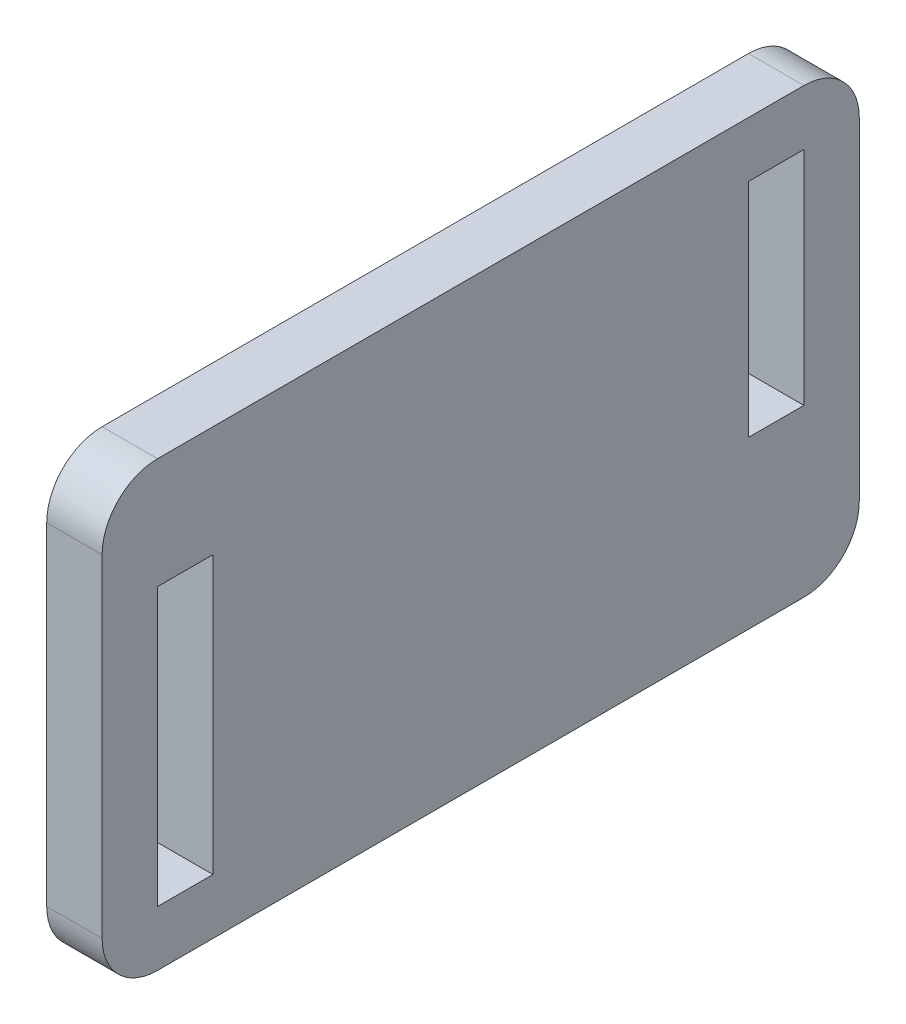
ISO-10303-21;
HEADER;
FILE_DESCRIPTION(('STEP AP214'),'2;1');
FILE_NAME('part.step','',(''),(''),'','','');
FILE_SCHEMA(('AUTOMOTIVE_DESIGN { 1 0 10303 214 1 1 1 1 }'));
ENDSEC;
DATA;
#1=APPLICATION_CONTEXT('core data for automotive mechanical design processes');
#2=APPLICATION_PROTOCOL_DEFINITION('international standard','automotive_design',2000,#1);
#3=PRODUCT_CONTEXT('',#1,'mechanical');
#4=PRODUCT('Part','Part','',(#3));
#5=PRODUCT_RELATED_PRODUCT_CATEGORY('part','',(#4));
#6=PRODUCT_DEFINITION_FORMATION('','',#4);
#7=PRODUCT_DEFINITION_CONTEXT('part definition',#1,'design');
#8=PRODUCT_DEFINITION('design','',#6,#7);
#9=PRODUCT_DEFINITION_SHAPE('','',#8);
#10=(LENGTH_UNIT() NAMED_UNIT(*) SI_UNIT(.MILLI.,.METRE.));
#11=(NAMED_UNIT(*) PLANE_ANGLE_UNIT() SI_UNIT($,.RADIAN.));
#12=(NAMED_UNIT(*) SI_UNIT($,.STERADIAN.) SOLID_ANGLE_UNIT());
#13=UNCERTAINTY_MEASURE_WITH_UNIT(LENGTH_MEASURE(1.E-05),#10,'distance_accuracy_value','');
#14=(GEOMETRIC_REPRESENTATION_CONTEXT(3) GLOBAL_UNCERTAINTY_ASSIGNED_CONTEXT((#13)) GLOBAL_UNIT_ASSIGNED_CONTEXT((#10,
#11,#12)) REPRESENTATION_CONTEXT('',''));
#15=CARTESIAN_POINT('',(0.,0.,0.));
#16=DIRECTION('',(0.,0.,1.));
#17=DIRECTION('',(1.,0.,0.));
#18=AXIS2_PLACEMENT_3D('',#15,#16,#17);
#19=CARTESIAN_POINT('',(3.,0.,0.));
#20=DIRECTION('',(-1.,0.,0.));
#21=DIRECTION('',(0.,0.,1.));
#22=AXIS2_PLACEMENT_3D('',#19,#20,#21);
#23=PLANE('',#22);
#24=DIRECTION('',(0.,-1.,0.));
#25=VECTOR('',#24,1.);
#26=CARTESIAN_POINT('',(3.,-9.00000000000001,17.5000000000001));
#27=LINE('',#26,#25);
#28=CARTESIAN_POINT('',(3.,5.99999999999999,17.5000000000001));
#29=VERTEX_POINT('',#28);
#30=CARTESIAN_POINT('',(3.,-9.00000000000001,17.5000000000001));
#31=VERTEX_POINT('',#30);
#32=EDGE_CURVE('E211',#29,#31,#27,.T.);
#33=ORIENTED_EDGE('',*,*,#32,.F.);
#34=DIRECTION('',(0.,0.,1.));
#35=VECTOR('',#34,1.);
#36=CARTESIAN_POINT('',(3.,5.99999999999999,17.5000000000001));
#37=LINE('',#36,#35);
#38=CARTESIAN_POINT('',(3.,5.99999999999999,14.5000000000001));
#39=VERTEX_POINT('',#38);
#40=EDGE_CURVE('E222',#39,#29,#37,.T.);
#41=ORIENTED_EDGE('',*,*,#40,.F.);
#42=DIRECTION('',(0.,1.,0.));
#43=VECTOR('',#42,1.);
#44=CARTESIAN_POINT('',(3.,-9.00000000000001,14.5000000000001));
#45=LINE('',#44,#43);
#46=CARTESIAN_POINT('',(3.,-9.00000000000001,14.5000000000001));
#47=VERTEX_POINT('',#46);
#48=EDGE_CURVE('E218',#47,#39,#45,.T.);
#49=ORIENTED_EDGE('',*,*,#48,.F.);
#50=DIRECTION('',(0.,0.,-1.));
#51=VECTOR('',#50,1.);
#52=CARTESIAN_POINT('',(3.,-9.00000000000001,17.5000000000001));
#53=LINE('',#52,#51);
#54=EDGE_CURVE('E214',#31,#47,#53,.T.);
#55=ORIENTED_EDGE('',*,*,#54,.F.);
#56=EDGE_LOOP('',(#33,#41,#49,#55));
#57=FACE_BOUND('',#56,.T.);
#58=DIRECTION('',(0.,0.,-1.));
#59=VECTOR('',#58,1.);
#60=CARTESIAN_POINT('',(3.,-12.,-20.5000000000001));
#61=LINE('',#60,#59);
#62=CARTESIAN_POINT('',(3.,-12.,17.5000000000001));
#63=VERTEX_POINT('',#62);
#64=CARTESIAN_POINT('',(3.,-12.,-17.5000000000001));
#65=VERTEX_POINT('',#64);
#66=EDGE_CURVE('E258',#63,#65,#61,.T.);
#67=ORIENTED_EDGE('',*,*,#66,.T.);
#68=CARTESIAN_POINT('',(3.,-9.00000000000001,-17.5000000000001));
#69=DIRECTION('',(-1.,0.,0.));
#70=DIRECTION('',(0.,0.,1.));
#71=AXIS2_PLACEMENT_3D('',#68,#69,#70);
#72=CIRCLE('',#71,3.);
#73=CARTESIAN_POINT('',(3.,-9.00000000000001,-20.5000000000001));
#74=VERTEX_POINT('',#73);
#75=EDGE_CURVE('E316',#65,#74,#72,.F.);
#76=ORIENTED_EDGE('',*,*,#75,.T.);
#77=DIRECTION('',(0.,1.,0.));
#78=VECTOR('',#77,1.);
#79=CARTESIAN_POINT('',(3.,12.,-20.5000000000001));
#80=LINE('',#79,#78);
#81=CARTESIAN_POINT('',(3.,9.00000000000001,-20.5000000000001));
#82=VERTEX_POINT('',#81);
#83=EDGE_CURVE('E263',#74,#82,#80,.T.);
#84=ORIENTED_EDGE('',*,*,#83,.T.);
#85=CARTESIAN_POINT('',(3.,9.00000000000001,-17.5000000000001));
#86=DIRECTION('',(-1.,0.,0.));
#87=DIRECTION('',(0.,0.,1.));
#88=AXIS2_PLACEMENT_3D('',#85,#86,#87);
#89=CIRCLE('',#88,3.);
#90=CARTESIAN_POINT('',(3.,12.,-17.5000000000001));
#91=VERTEX_POINT('',#90);
#92=EDGE_CURVE('E64',#82,#91,#89,.F.);
#93=ORIENTED_EDGE('',*,*,#92,.T.);
#94=DIRECTION('',(0.,0.,1.));
#95=VECTOR('',#94,1.);
#96=CARTESIAN_POINT('',(3.,12.,20.5000000000001));
#97=LINE('',#96,#95);
#98=CARTESIAN_POINT('',(3.,12.,17.5000000000001));
#99=VERTEX_POINT('',#98);
#100=EDGE_CURVE('E266',#91,#99,#97,.T.);
#101=ORIENTED_EDGE('',*,*,#100,.T.);
#102=CARTESIAN_POINT('',(3.,9.00000000000001,17.5000000000001));
#103=DIRECTION('',(-1.,0.,0.));
#104=DIRECTION('',(0.,0.,1.));
#105=AXIS2_PLACEMENT_3D('',#102,#103,#104);
#106=CIRCLE('',#105,3.);
#107=CARTESIAN_POINT('',(3.,9.00000000000001,20.5000000000001));
#108=VERTEX_POINT('',#107);
#109=EDGE_CURVE('E310',#99,#108,#106,.F.);
#110=ORIENTED_EDGE('',*,*,#109,.T.);
#111=DIRECTION('',(0.,-1.,0.));
#112=VECTOR('',#111,1.);
#113=CARTESIAN_POINT('',(3.,-12.,20.5000000000001));
#114=LINE('',#113,#112);
#115=CARTESIAN_POINT('',(3.,-9.00000000000001,20.5000000000001));
#116=VERTEX_POINT('',#115);
#117=EDGE_CURVE('E254',#108,#116,#114,.T.);
#118=ORIENTED_EDGE('',*,*,#117,.T.);
#119=CARTESIAN_POINT('',(3.,-9.00000000000001,17.5000000000001));
#120=DIRECTION('',(-1.,0.,0.));
#121=DIRECTION('',(0.,0.,1.));
#122=AXIS2_PLACEMENT_3D('',#119,#120,#121);
#123=CIRCLE('',#122,3.);
#124=EDGE_CURVE('E313',#116,#63,#123,.F.);
#125=ORIENTED_EDGE('',*,*,#124,.T.);
#126=EDGE_LOOP('',(#67,#76,#84,#93,#101,#110,#118,#125));
#127=FACE_BOUND('',#126,.T.);
#128=DIRECTION('',(0.,-1.,0.));
#129=VECTOR('',#128,1.);
#130=CARTESIAN_POINT('',(3.,-3.,-14.5000000000001));
#131=LINE('',#130,#129);
#132=CARTESIAN_POINT('',(3.,9.00000000000001,-14.5000000000001));
#133=VERTEX_POINT('',#132);
#134=CARTESIAN_POINT('',(3.,-3.,-14.5000000000001));
#135=VERTEX_POINT('',#134);
#136=EDGE_CURVE('E158',#133,#135,#131,.T.);
#137=ORIENTED_EDGE('',*,*,#136,.F.);
#138=DIRECTION('',(0.,0.,1.));
#139=VECTOR('',#138,1.);
#140=CARTESIAN_POINT('',(3.,9.00000000000001,-14.5000000000001));
#141=LINE('',#140,#139);
#142=CARTESIAN_POINT('',(3.,9.00000000000001,-17.5000000000001));
#143=VERTEX_POINT('',#142);
#144=EDGE_CURVE('E187',#143,#133,#141,.T.);
#145=ORIENTED_EDGE('',*,*,#144,.F.);
#146=DIRECTION('',(0.,1.,0.));
#147=VECTOR('',#146,1.);
#148=CARTESIAN_POINT('',(3.,-3.,-17.5000000000001));
#149=LINE('',#148,#147);
#150=CARTESIAN_POINT('',(3.,-3.,-17.5000000000001));
#151=VERTEX_POINT('',#150);
#152=EDGE_CURVE('E183',#151,#143,#149,.T.);
#153=ORIENTED_EDGE('',*,*,#152,.F.);
#154=DIRECTION('',(0.,0.,-1.));
#155=VECTOR('',#154,1.);
#156=CARTESIAN_POINT('',(3.,-3.,-14.5000000000001));
#157=LINE('',#156,#155);
#158=EDGE_CURVE('E169',#135,#151,#157,.T.);
#159=ORIENTED_EDGE('',*,*,#158,.F.);
#160=EDGE_LOOP('',(#137,#145,#153,#159));
#161=FACE_BOUND('',#160,.T.);
#162=ADVANCED_FACE('F43',(#57,#127,#161),#23,.F.);
#163=CARTESIAN_POINT('',(0.,0.,0.));
#164=DIRECTION('',(-1.,0.,0.));
#165=DIRECTION('',(0.,0.,1.));
#166=AXIS2_PLACEMENT_3D('',#163,#164,#165);
#167=PLANE('',#166);
#168=DIRECTION('',(0.,1.,0.));
#169=VECTOR('',#168,1.);
#170=CARTESIAN_POINT('',(0.,12.,-20.5000000000001));
#171=LINE('',#170,#169);
#172=CARTESIAN_POINT('',(0.,-9.00000000000001,-20.5000000000001));
#173=VERTEX_POINT('',#172);
#174=CARTESIAN_POINT('',(0.,9.00000000000001,-20.5000000000001));
#175=VERTEX_POINT('',#174);
#176=EDGE_CURVE('E273',#173,#175,#171,.T.);
#177=ORIENTED_EDGE('',*,*,#176,.F.);
#178=CARTESIAN_POINT('',(0.,-9.00000000000001,-17.5000000000001));
#179=DIRECTION('',(-1.,0.,0.));
#180=DIRECTION('',(0.,0.,1.));
#181=AXIS2_PLACEMENT_3D('',#178,#179,#180);
#182=CIRCLE('',#181,3.);
#183=CARTESIAN_POINT('',(0.,-12.,-17.5000000000001));
#184=VERTEX_POINT('',#183);
#185=EDGE_CURVE('E298',#173,#184,#182,.T.);
#186=ORIENTED_EDGE('',*,*,#185,.T.);
#187=DIRECTION('',(0.,0.,-1.));
#188=VECTOR('',#187,1.);
#189=CARTESIAN_POINT('',(0.,-12.,-20.5000000000001));
#190=LINE('',#189,#188);
#191=CARTESIAN_POINT('',(0.,-12.,17.5000000000001));
#192=VERTEX_POINT('',#191);
#193=EDGE_CURVE('E253',#192,#184,#190,.T.);
#194=ORIENTED_EDGE('',*,*,#193,.F.);
#195=CARTESIAN_POINT('',(0.,-9.00000000000001,17.5000000000001));
#196=DIRECTION('',(-1.,0.,0.));
#197=DIRECTION('',(0.,0.,1.));
#198=AXIS2_PLACEMENT_3D('',#195,#196,#197);
#199=CIRCLE('',#198,3.);
#200=CARTESIAN_POINT('',(0.,-9.00000000000001,20.5000000000001));
#201=VERTEX_POINT('',#200);
#202=EDGE_CURVE('E295',#192,#201,#199,.T.);
#203=ORIENTED_EDGE('',*,*,#202,.T.);
#204=DIRECTION('',(0.,-1.,0.));
#205=VECTOR('',#204,1.);
#206=CARTESIAN_POINT('',(0.,-9.,20.5000000000001));
#207=LINE('',#206,#205);
#208=CARTESIAN_POINT('',(0.,9.,20.5000000000001));
#209=VERTEX_POINT('',#208);
#210=EDGE_CURVE('E259',#209,#201,#207,.T.);
#211=ORIENTED_EDGE('',*,*,#210,.F.);
#212=CARTESIAN_POINT('',(0.,9.00000000000001,17.5000000000001));
#213=DIRECTION('',(-1.,0.,0.));
#214=DIRECTION('',(0.,0.,1.));
#215=AXIS2_PLACEMENT_3D('',#212,#213,#214);
#216=CIRCLE('',#215,3.);
#217=CARTESIAN_POINT('',(0.,12.,17.5000000000001));
#218=VERTEX_POINT('',#217);
#219=EDGE_CURVE('E292',#209,#218,#216,.T.);
#220=ORIENTED_EDGE('',*,*,#219,.T.);
#221=DIRECTION('',(0.,0.,1.));
#222=VECTOR('',#221,1.);
#223=CARTESIAN_POINT('',(0.,12.,20.5000000000001));
#224=LINE('',#223,#222);
#225=CARTESIAN_POINT('',(0.,12.,-17.5000000000001));
#226=VERTEX_POINT('',#225);
#227=EDGE_CURVE('E277',#226,#218,#224,.T.);
#228=ORIENTED_EDGE('',*,*,#227,.F.);
#229=CARTESIAN_POINT('',(0.,9.00000000000001,-17.5000000000001));
#230=DIRECTION('',(-1.,0.,0.));
#231=DIRECTION('',(0.,0.,1.));
#232=AXIS2_PLACEMENT_3D('',#229,#230,#231);
#233=CIRCLE('',#232,3.);
#234=EDGE_CURVE('E289',#226,#175,#233,.T.);
#235=ORIENTED_EDGE('',*,*,#234,.T.);
#236=EDGE_LOOP('',(#177,#186,#194,#203,#211,#220,#228,#235));
#237=FACE_BOUND('',#236,.T.);
#238=DIRECTION('',(0.,0.,1.));
#239=VECTOR('',#238,1.);
#240=CARTESIAN_POINT('',(0.,5.99999999999999,17.5000000000001));
#241=LINE('',#240,#239);
#242=CARTESIAN_POINT('',(0.,5.99999999999999,14.5000000000001));
#243=VERTEX_POINT('',#242);
#244=CARTESIAN_POINT('',(0.,5.99999999999999,17.5000000000001));
#245=VERTEX_POINT('',#244);
#246=EDGE_CURVE('E215',#243,#245,#241,.T.);
#247=ORIENTED_EDGE('',*,*,#246,.T.);
#248=DIRECTION('',(0.,-1.,0.));
#249=VECTOR('',#248,1.);
#250=CARTESIAN_POINT('',(0.,-9.00000000000001,17.5000000000001));
#251=LINE('',#250,#249);
#252=CARTESIAN_POINT('',(0.,-9.00000000000001,17.5000000000001));
#253=VERTEX_POINT('',#252);
#254=EDGE_CURVE('E178',#245,#253,#251,.T.);
#255=ORIENTED_EDGE('',*,*,#254,.T.);
#256=DIRECTION('',(0.,0.,-1.));
#257=VECTOR('',#256,1.);
#258=CARTESIAN_POINT('',(0.,-9.00000000000001,17.5000000000001));
#259=LINE('',#258,#257);
#260=CARTESIAN_POINT('',(0.,-9.00000000000001,14.5000000000001));
#261=VERTEX_POINT('',#260);
#262=EDGE_CURVE('E229',#253,#261,#259,.T.);
#263=ORIENTED_EDGE('',*,*,#262,.T.);
#264=DIRECTION('',(0.,1.,0.));
#265=VECTOR('',#264,1.);
#266=CARTESIAN_POINT('',(0.,-9.00000000000001,14.5000000000001));
#267=LINE('',#266,#265);
#268=EDGE_CURVE('E233',#261,#243,#267,.T.);
#269=ORIENTED_EDGE('',*,*,#268,.T.);
#270=EDGE_LOOP('',(#247,#255,#263,#269));
#271=FACE_BOUND('',#270,.T.);
#272=DIRECTION('',(0.,0.,1.));
#273=VECTOR('',#272,1.);
#274=CARTESIAN_POINT('',(0.,9.00000000000001,-14.5000000000001));
#275=LINE('',#274,#273);
#276=CARTESIAN_POINT('',(0.,9.00000000000001,-17.5000000000001));
#277=VERTEX_POINT('',#276);
#278=CARTESIAN_POINT('',(0.,9.00000000000001,-14.5000000000001));
#279=VERTEX_POINT('',#278);
#280=EDGE_CURVE('E170',#277,#279,#275,.T.);
#281=ORIENTED_EDGE('',*,*,#280,.T.);
#282=DIRECTION('',(0.,-1.,0.));
#283=VECTOR('',#282,1.);
#284=CARTESIAN_POINT('',(0.,-3.,-14.5000000000001));
#285=LINE('',#284,#283);
#286=CARTESIAN_POINT('',(0.,-3.,-14.5000000000001));
#287=VERTEX_POINT('',#286);
#288=EDGE_CURVE('E192',#279,#287,#285,.T.);
#289=ORIENTED_EDGE('',*,*,#288,.T.);
#290=DIRECTION('',(0.,0.,-1.));
#291=VECTOR('',#290,1.);
#292=CARTESIAN_POINT('',(0.,-3.,-14.5000000000001));
#293=LINE('',#292,#291);
#294=CARTESIAN_POINT('',(0.,-3.,-17.5000000000001));
#295=VERTEX_POINT('',#294);
#296=EDGE_CURVE('E176',#287,#295,#293,.T.);
#297=ORIENTED_EDGE('',*,*,#296,.T.);
#298=DIRECTION('',(0.,1.,0.));
#299=VECTOR('',#298,1.);
#300=CARTESIAN_POINT('',(0.,-3.,-17.5000000000001));
#301=LINE('',#300,#299);
#302=EDGE_CURVE('E197',#295,#277,#301,.T.);
#303=ORIENTED_EDGE('',*,*,#302,.T.);
#304=EDGE_LOOP('',(#281,#289,#297,#303));
#305=FACE_BOUND('',#304,.T.);
#306=ADVANCED_FACE('F333',(#237,#271,#305),#167,.T.);
#307=CARTESIAN_POINT('',(3.,-12.,-20.5000000000001));
#308=DIRECTION('',(0.,1.,0.));
#309=DIRECTION('',(0.,0.,1.));
#310=AXIS2_PLACEMENT_3D('',#307,#308,#309);
#311=PLANE('',#310);
#312=ORIENTED_EDGE('',*,*,#193,.T.);
#313=DIRECTION('',(-1.,0.,0.));
#314=VECTOR('',#313,1.);
#315=CARTESIAN_POINT('',(3.,-12.,-17.5000000000001));
#316=LINE('',#315,#314);
#317=EDGE_CURVE('E305',#184,#65,#316,.F.);
#318=ORIENTED_EDGE('',*,*,#317,.T.);
#319=ORIENTED_EDGE('',*,*,#66,.F.);
#320=DIRECTION('',(-1.,0.,0.));
#321=VECTOR('',#320,1.);
#322=CARTESIAN_POINT('',(3.,-12.,17.5000000000001));
#323=LINE('',#322,#321);
#324=EDGE_CURVE('E301',#63,#192,#323,.T.);
#325=ORIENTED_EDGE('',*,*,#324,.T.);
#326=EDGE_LOOP('',(#312,#318,#319,#325));
#327=FACE_BOUND('',#326,.T.);
#328=ADVANCED_FACE('F351',(#327),#311,.F.);
#329=CARTESIAN_POINT('',(3.,12.,-20.5000000000001));
#330=DIRECTION('',(0.,0.,1.));
#331=DIRECTION('',(1.,0.,0.));
#332=AXIS2_PLACEMENT_3D('',#329,#330,#331);
#333=PLANE('',#332);
#334=ORIENTED_EDGE('',*,*,#83,.F.);
#335=DIRECTION('',(-1.,0.,0.));
#336=VECTOR('',#335,1.);
#337=CARTESIAN_POINT('',(3.,-9.00000000000001,-20.5000000000001));
#338=LINE('',#337,#336);
#339=EDGE_CURVE('E285',#74,#173,#338,.T.);
#340=ORIENTED_EDGE('',*,*,#339,.T.);
#341=ORIENTED_EDGE('',*,*,#176,.T.);
#342=DIRECTION('',(-1.,0.,0.));
#343=VECTOR('',#342,1.);
#344=CARTESIAN_POINT('',(3.,9.00000000000001,-20.5000000000001));
#345=LINE('',#344,#343);
#346=EDGE_CURVE('E269',#175,#82,#345,.F.);
#347=ORIENTED_EDGE('',*,*,#346,.T.);
#348=EDGE_LOOP('',(#334,#340,#341,#347));
#349=FACE_BOUND('',#348,.T.);
#350=ADVANCED_FACE('F359',(#349),#333,.F.);
#351=CARTESIAN_POINT('',(3.,12.,20.5000000000001));
#352=DIRECTION('',(0.,-1.,0.));
#353=DIRECTION('',(0.,0.,-1.));
#354=AXIS2_PLACEMENT_3D('',#351,#352,#353);
#355=PLANE('',#354);
#356=ORIENTED_EDGE('',*,*,#227,.T.);
#357=DIRECTION('',(-1.,0.,0.));
#358=VECTOR('',#357,1.);
#359=CARTESIAN_POINT('',(3.,12.,17.5000000000001));
#360=LINE('',#359,#358);
#361=EDGE_CURVE('E11',#218,#99,#360,.F.);
#362=ORIENTED_EDGE('',*,*,#361,.T.);
#363=ORIENTED_EDGE('',*,*,#100,.F.);
#364=DIRECTION('',(-1.,0.,0.));
#365=VECTOR('',#364,1.);
#366=CARTESIAN_POINT('',(3.,12.,-17.5000000000001));
#367=LINE('',#366,#365);
#368=EDGE_CURVE('E52',#91,#226,#367,.T.);
#369=ORIENTED_EDGE('',*,*,#368,.T.);
#370=EDGE_LOOP('',(#356,#362,#363,#369));
#371=FACE_BOUND('',#370,.T.);
#372=ADVANCED_FACE('F329',(#371),#355,.F.);
#373=CARTESIAN_POINT('',(3.,-9.,20.5000000000001));
#374=DIRECTION('',(0.,0.,-1.));
#375=DIRECTION('',(-1.,0.,0.));
#376=AXIS2_PLACEMENT_3D('',#373,#374,#375);
#377=PLANE('',#376);
#378=ORIENTED_EDGE('',*,*,#210,.T.);
#379=DIRECTION('',(-1.,0.,0.));
#380=VECTOR('',#379,1.);
#381=CARTESIAN_POINT('',(3.,-9.00000000000001,20.5000000000001));
#382=LINE('',#381,#380);
#383=EDGE_CURVE('E323',#201,#116,#382,.F.);
#384=ORIENTED_EDGE('',*,*,#383,.T.);
#385=ORIENTED_EDGE('',*,*,#117,.F.);
#386=DIRECTION('',(-1.,0.,0.));
#387=VECTOR('',#386,1.);
#388=CARTESIAN_POINT('',(3.,9.00000000000001,20.5000000000001));
#389=LINE('',#388,#387);
#390=EDGE_CURVE('E319',#108,#209,#389,.T.);
#391=ORIENTED_EDGE('',*,*,#390,.T.);
#392=EDGE_LOOP('',(#378,#384,#385,#391));
#393=FACE_BOUND('',#392,.T.);
#394=ADVANCED_FACE('F342',(#393),#377,.F.);
#395=CARTESIAN_POINT('',(3.,-9.00000000000001,17.5000000000001));
#396=DIRECTION('',(0.,0.,-1.));
#397=DIRECTION('',(-1.,0.,0.));
#398=AXIS2_PLACEMENT_3D('',#395,#396,#397);
#399=PLANE('',#398);
#400=ORIENTED_EDGE('',*,*,#254,.F.);
#401=DIRECTION('',(-1.,0.,0.));
#402=VECTOR('',#401,1.);
#403=CARTESIAN_POINT('',(3.,5.99999999999999,17.5000000000001));
#404=LINE('',#403,#402);
#405=EDGE_CURVE('E225',#29,#245,#404,.T.);
#406=ORIENTED_EDGE('',*,*,#405,.F.);
#407=ORIENTED_EDGE('',*,*,#32,.T.);
#408=DIRECTION('',(-1.,0.,0.));
#409=VECTOR('',#408,1.);
#410=CARTESIAN_POINT('',(3.,-9.00000000000001,17.5000000000001));
#411=LINE('',#410,#409);
#412=EDGE_CURVE('E249',#31,#253,#411,.T.);
#413=ORIENTED_EDGE('',*,*,#412,.T.);
#414=EDGE_LOOP('',(#400,#406,#407,#413));
#415=FACE_BOUND('',#414,.T.);
#416=ADVANCED_FACE('F374',(#415),#399,.T.);
#417=CARTESIAN_POINT('',(3.,-9.00000000000001,17.5000000000001));
#418=DIRECTION('',(0.,1.,0.));
#419=DIRECTION('',(0.,0.,1.));
#420=AXIS2_PLACEMENT_3D('',#417,#418,#419);
#421=PLANE('',#420);
#422=ORIENTED_EDGE('',*,*,#262,.F.);
#423=ORIENTED_EDGE('',*,*,#412,.F.);
#424=ORIENTED_EDGE('',*,*,#54,.T.);
#425=DIRECTION('',(-1.,0.,0.));
#426=VECTOR('',#425,1.);
#427=CARTESIAN_POINT('',(3.,-9.00000000000001,14.5000000000001));
#428=LINE('',#427,#426);
#429=EDGE_CURVE('E246',#47,#261,#428,.T.);
#430=ORIENTED_EDGE('',*,*,#429,.T.);
#431=EDGE_LOOP('',(#422,#423,#424,#430));
#432=FACE_BOUND('',#431,.T.);
#433=ADVANCED_FACE('F469',(#432),#421,.T.);
#434=CARTESIAN_POINT('',(3.,-9.00000000000001,14.5000000000001));
#435=DIRECTION('',(0.,0.,1.));
#436=DIRECTION('',(1.,0.,0.));
#437=AXIS2_PLACEMENT_3D('',#434,#435,#436);
#438=PLANE('',#437);
#439=ORIENTED_EDGE('',*,*,#268,.F.);
#440=ORIENTED_EDGE('',*,*,#429,.F.);
#441=ORIENTED_EDGE('',*,*,#48,.T.);
#442=DIRECTION('',(-1.,0.,0.));
#443=VECTOR('',#442,1.);
#444=CARTESIAN_POINT('',(3.,5.99999999999999,14.5000000000001));
#445=LINE('',#444,#443);
#446=EDGE_CURVE('E243',#39,#243,#445,.T.);
#447=ORIENTED_EDGE('',*,*,#446,.T.);
#448=EDGE_LOOP('',(#439,#440,#441,#447));
#449=FACE_BOUND('',#448,.T.);
#450=ADVANCED_FACE('F459',(#449),#438,.T.);
#451=CARTESIAN_POINT('',(3.,5.99999999999999,17.5000000000001));
#452=DIRECTION('',(0.,-1.,0.));
#453=DIRECTION('',(0.,0.,-1.));
#454=AXIS2_PLACEMENT_3D('',#451,#452,#453);
#455=PLANE('',#454);
#456=ORIENTED_EDGE('',*,*,#246,.F.);
#457=ORIENTED_EDGE('',*,*,#446,.F.);
#458=ORIENTED_EDGE('',*,*,#40,.T.);
#459=ORIENTED_EDGE('',*,*,#405,.T.);
#460=EDGE_LOOP('',(#456,#457,#458,#459));
#461=FACE_BOUND('',#460,.T.);
#462=ADVANCED_FACE('F450',(#461),#455,.T.);
#463=CARTESIAN_POINT('',(3.,-3.,-14.5000000000001));
#464=DIRECTION('',(0.,0.,-1.));
#465=DIRECTION('',(-1.,0.,0.));
#466=AXIS2_PLACEMENT_3D('',#463,#464,#465);
#467=PLANE('',#466);
#468=ORIENTED_EDGE('',*,*,#288,.F.);
#469=DIRECTION('',(-1.,0.,0.));
#470=VECTOR('',#469,1.);
#471=CARTESIAN_POINT('',(3.,9.00000000000001,-14.5000000000001));
#472=LINE('',#471,#470);
#473=EDGE_CURVE('E164',#133,#279,#472,.T.);
#474=ORIENTED_EDGE('',*,*,#473,.F.);
#475=ORIENTED_EDGE('',*,*,#136,.T.);
#476=DIRECTION('',(-1.,0.,0.));
#477=VECTOR('',#476,1.);
#478=CARTESIAN_POINT('',(3.,-3.,-14.5000000000001));
#479=LINE('',#478,#477);
#480=EDGE_CURVE('E161',#135,#287,#479,.T.);
#481=ORIENTED_EDGE('',*,*,#480,.T.);
#482=EDGE_LOOP('',(#468,#474,#475,#481));
#483=FACE_BOUND('',#482,.T.);
#484=ADVANCED_FACE('F160',(#483),#467,.T.);
#485=CARTESIAN_POINT('',(3.,-3.,-14.5000000000001));
#486=DIRECTION('',(0.,1.,0.));
#487=DIRECTION('',(0.,0.,1.));
#488=AXIS2_PLACEMENT_3D('',#485,#486,#487);
#489=PLANE('',#488);
#490=ORIENTED_EDGE('',*,*,#296,.F.);
#491=ORIENTED_EDGE('',*,*,#480,.F.);
#492=ORIENTED_EDGE('',*,*,#158,.T.);
#493=DIRECTION('',(-1.,0.,0.));
#494=VECTOR('',#493,1.);
#495=CARTESIAN_POINT('',(3.,-3.,-17.5000000000001));
#496=LINE('',#495,#494);
#497=EDGE_CURVE('E179',#151,#295,#496,.T.);
#498=ORIENTED_EDGE('',*,*,#497,.T.);
#499=EDGE_LOOP('',(#490,#491,#492,#498));
#500=FACE_BOUND('',#499,.T.);
#501=ADVANCED_FACE('F173',(#500),#489,.T.);
#502=CARTESIAN_POINT('',(3.,-3.,-17.5000000000001));
#503=DIRECTION('',(0.,0.,1.));
#504=DIRECTION('',(1.,0.,0.));
#505=AXIS2_PLACEMENT_3D('',#502,#503,#504);
#506=PLANE('',#505);
#507=ORIENTED_EDGE('',*,*,#302,.F.);
#508=ORIENTED_EDGE('',*,*,#497,.F.);
#509=ORIENTED_EDGE('',*,*,#152,.T.);
#510=DIRECTION('',(-1.,0.,0.));
#511=VECTOR('',#510,1.);
#512=CARTESIAN_POINT('',(3.,9.00000000000001,-17.5000000000001));
#513=LINE('',#512,#511);
#514=EDGE_CURVE('E206',#143,#277,#513,.T.);
#515=ORIENTED_EDGE('',*,*,#514,.T.);
#516=EDGE_LOOP('',(#507,#508,#509,#515));
#517=FACE_BOUND('',#516,.T.);
#518=ADVANCED_FACE('F423',(#517),#506,.T.);
#519=CARTESIAN_POINT('',(3.,9.00000000000001,-14.5000000000001));
#520=DIRECTION('',(0.,-1.,0.));
#521=DIRECTION('',(0.,0.,-1.));
#522=AXIS2_PLACEMENT_3D('',#519,#520,#521);
#523=PLANE('',#522);
#524=ORIENTED_EDGE('',*,*,#280,.F.);
#525=ORIENTED_EDGE('',*,*,#514,.F.);
#526=ORIENTED_EDGE('',*,*,#144,.T.);
#527=ORIENTED_EDGE('',*,*,#473,.T.);
#528=EDGE_LOOP('',(#524,#525,#526,#527));
#529=FACE_BOUND('',#528,.T.);
#530=ADVANCED_FACE('F387',(#529),#523,.T.);
#531=CARTESIAN_POINT('',(3.,-9.00000000000001,-17.5000000000001));
#532=DIRECTION('',(-1.,0.,0.));
#533=DIRECTION('',(0.,0.,1.));
#534=AXIS2_PLACEMENT_3D('',#531,#532,#533);
#535=CYLINDRICAL_SURFACE('',#534,3.);
#536=ORIENTED_EDGE('',*,*,#75,.F.);
#537=ORIENTED_EDGE('',*,*,#317,.F.);
#538=ORIENTED_EDGE('',*,*,#185,.F.);
#539=ORIENTED_EDGE('',*,*,#339,.F.);
#540=EDGE_LOOP('',(#536,#537,#538,#539));
#541=FACE_BOUND('',#540,.T.);
#542=ADVANCED_FACE('F356',(#541),#535,.T.);
#543=CARTESIAN_POINT('',(3.,-9.00000000000001,17.5000000000001));
#544=DIRECTION('',(-1.,0.,0.));
#545=DIRECTION('',(0.,0.,1.));
#546=AXIS2_PLACEMENT_3D('',#543,#544,#545);
#547=CYLINDRICAL_SURFACE('',#546,3.);
#548=ORIENTED_EDGE('',*,*,#124,.F.);
#549=ORIENTED_EDGE('',*,*,#383,.F.);
#550=ORIENTED_EDGE('',*,*,#202,.F.);
#551=ORIENTED_EDGE('',*,*,#324,.F.);
#552=EDGE_LOOP('',(#548,#549,#550,#551));
#553=FACE_BOUND('',#552,.T.);
#554=ADVANCED_FACE('F348',(#553),#547,.T.);
#555=CARTESIAN_POINT('',(3.,9.00000000000001,17.5000000000001));
#556=DIRECTION('',(-1.,0.,0.));
#557=DIRECTION('',(0.,0.,1.));
#558=AXIS2_PLACEMENT_3D('',#555,#556,#557);
#559=CYLINDRICAL_SURFACE('',#558,3.);
#560=ORIENTED_EDGE('',*,*,#109,.F.);
#561=ORIENTED_EDGE('',*,*,#361,.F.);
#562=ORIENTED_EDGE('',*,*,#219,.F.);
#563=ORIENTED_EDGE('',*,*,#390,.F.);
#564=EDGE_LOOP('',(#560,#561,#562,#563));
#565=FACE_BOUND('',#564,.T.);
#566=ADVANCED_FACE('F339',(#565),#559,.T.);
#567=CARTESIAN_POINT('',(3.,9.00000000000001,-17.5000000000001));
#568=DIRECTION('',(-1.,0.,0.));
#569=DIRECTION('',(0.,0.,1.));
#570=AXIS2_PLACEMENT_3D('',#567,#568,#569);
#571=CYLINDRICAL_SURFACE('',#570,3.);
#572=ORIENTED_EDGE('',*,*,#92,.F.);
#573=ORIENTED_EDGE('',*,*,#346,.F.);
#574=ORIENTED_EDGE('',*,*,#234,.F.);
#575=ORIENTED_EDGE('',*,*,#368,.F.);
#576=EDGE_LOOP('',(#572,#573,#574,#575));
#577=FACE_BOUND('',#576,.T.);
#578=ADVANCED_FACE('F45',(#577),#571,.T.);
#579=CLOSED_SHELL('',(#162,#306,#328,#350,#372,#394,#416,#433,#450,#462,#484,#501,#518,#530,
#542,#554,#566,#578));
#580=MANIFOLD_SOLID_BREP('B2',#579);
#581=ADVANCED_BREP_SHAPE_REPRESENTATION('',(#18,#580),#14);
#582=SHAPE_DEFINITION_REPRESENTATION(#9,#581);
ENDSEC;
END-ISO-10303-21;
